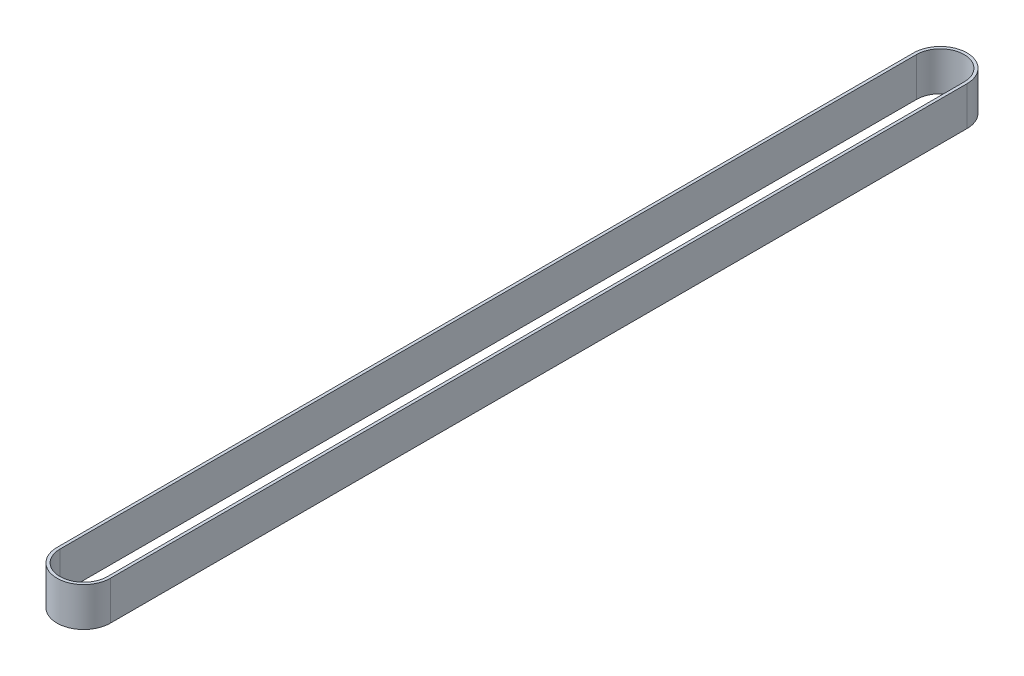
ISO-10303-21;
HEADER;
FILE_DESCRIPTION(('STEP AP214'),'2;1');
FILE_NAME('part.step','',(''),(''),'','','');
FILE_SCHEMA(('AUTOMOTIVE_DESIGN { 1 0 10303 214 1 1 1 1 }'));
ENDSEC;
DATA;
#1=APPLICATION_CONTEXT('core data for automotive mechanical design processes');
#2=APPLICATION_PROTOCOL_DEFINITION('international standard','automotive_design',2000,#1);
#3=PRODUCT_CONTEXT('',#1,'mechanical');
#4=PRODUCT('Part','Part','',(#3));
#5=PRODUCT_RELATED_PRODUCT_CATEGORY('part','',(#4));
#6=PRODUCT_DEFINITION_FORMATION('','',#4);
#7=PRODUCT_DEFINITION_CONTEXT('part definition',#1,'design');
#8=PRODUCT_DEFINITION('design','',#6,#7);
#9=PRODUCT_DEFINITION_SHAPE('','',#8);
#10=(LENGTH_UNIT() NAMED_UNIT(*) SI_UNIT(.MILLI.,.METRE.));
#11=(NAMED_UNIT(*) PLANE_ANGLE_UNIT() SI_UNIT($,.RADIAN.));
#12=(NAMED_UNIT(*) SI_UNIT($,.STERADIAN.) SOLID_ANGLE_UNIT());
#13=UNCERTAINTY_MEASURE_WITH_UNIT(LENGTH_MEASURE(1.E-05),#10,'distance_accuracy_value','');
#14=(GEOMETRIC_REPRESENTATION_CONTEXT(3) GLOBAL_UNCERTAINTY_ASSIGNED_CONTEXT((#13)) GLOBAL_UNIT_ASSIGNED_CONTEXT((#10,
#11,#12)) REPRESENTATION_CONTEXT('',''));
#15=CARTESIAN_POINT('',(0.,0.,0.));
#16=DIRECTION('',(0.,0.,1.));
#17=DIRECTION('',(1.,0.,0.));
#18=AXIS2_PLACEMENT_3D('',#15,#16,#17);
#19=CARTESIAN_POINT('',(0.,10.,110.05));
#20=DIRECTION('',(0.,1.,0.));
#21=DIRECTION('',(0.,0.,1.));
#22=AXIS2_PLACEMENT_3D('',#19,#20,#21);
#23=PLANE('',#22);
#24=CARTESIAN_POINT('',(0.,10.,110.05));
#25=DIRECTION('',(0.,1.,0.));
#26=DIRECTION('',(0.,0.,1.));
#27=AXIS2_PLACEMENT_3D('',#24,#25,#26);
#28=CIRCLE('',#27,6.86000000000003);
#29=CARTESIAN_POINT('',(-6.86000000000003,10.,110.05));
#30=VERTEX_POINT('',#29);
#31=CARTESIAN_POINT('',(6.86000000000003,10.,110.05));
#32=VERTEX_POINT('',#31);
#33=EDGE_CURVE('E142',#30,#32,#28,.T.);
#34=ORIENTED_EDGE('',*,*,#33,.T.);
#35=DIRECTION('',(0.,0.,-1.));
#36=VECTOR('',#35,1.);
#37=CARTESIAN_POINT('',(6.86000000000003,10.,110.05));
#38=LINE('',#37,#36);
#39=CARTESIAN_POINT('',(6.86,10.,-110.05));
#40=VERTEX_POINT('',#39);
#41=EDGE_CURVE('E145',#32,#40,#38,.T.);
#42=ORIENTED_EDGE('',*,*,#41,.T.);
#43=CARTESIAN_POINT('',(0.,10.,-110.05));
#44=DIRECTION('',(0.,1.,0.));
#45=DIRECTION('',(0.,0.,1.));
#46=AXIS2_PLACEMENT_3D('',#43,#44,#45);
#47=CIRCLE('',#46,6.86000000000003);
#48=CARTESIAN_POINT('',(-6.86000000000005,10.,-110.05));
#49=VERTEX_POINT('',#48);
#50=EDGE_CURVE('E148',#40,#49,#47,.T.);
#51=ORIENTED_EDGE('',*,*,#50,.T.);
#52=DIRECTION('',(0.,0.,1.));
#53=VECTOR('',#52,1.);
#54=CARTESIAN_POINT('',(-6.86000000000003,10.,110.05));
#55=LINE('',#54,#53);
#56=EDGE_CURVE('E150',#49,#30,#55,.T.);
#57=ORIENTED_EDGE('',*,*,#56,.T.);
#58=EDGE_LOOP('',(#34,#42,#51,#57));
#59=FACE_BOUND('',#58,.T.);
#60=DIRECTION('',(0.,0.,-1.));
#61=VECTOR('',#60,1.);
#62=CARTESIAN_POINT('',(6.11000000000006,10.,110.05));
#63=LINE('',#62,#61);
#64=CARTESIAN_POINT('',(6.11000000000006,10.,110.05));
#65=VERTEX_POINT('',#64);
#66=CARTESIAN_POINT('',(6.11000000000001,10.,-110.05));
#67=VERTEX_POINT('',#66);
#68=EDGE_CURVE('E114',#65,#67,#63,.T.);
#69=ORIENTED_EDGE('',*,*,#68,.F.);
#70=CARTESIAN_POINT('',(0.,10.,110.05));
#71=DIRECTION('',(0.,1.,0.));
#72=DIRECTION('',(0.,0.,1.));
#73=AXIS2_PLACEMENT_3D('',#70,#71,#72);
#74=CIRCLE('',#73,6.11);
#75=CARTESIAN_POINT('',(-6.10999999999994,10.,110.05));
#76=VERTEX_POINT('',#75);
#77=EDGE_CURVE('E106',#76,#65,#74,.T.);
#78=ORIENTED_EDGE('',*,*,#77,.F.);
#79=DIRECTION('',(0.,0.,1.));
#80=VECTOR('',#79,1.);
#81=CARTESIAN_POINT('',(-6.10999999999994,10.,110.05));
#82=LINE('',#81,#80);
#83=CARTESIAN_POINT('',(-6.10999999999999,10.,-110.05));
#84=VERTEX_POINT('',#83);
#85=EDGE_CURVE('E128',#84,#76,#82,.T.);
#86=ORIENTED_EDGE('',*,*,#85,.F.);
#87=CARTESIAN_POINT('',(0.,10.,-110.05));
#88=DIRECTION('',(0.,1.,0.));
#89=DIRECTION('',(0.,0.,1.));
#90=AXIS2_PLACEMENT_3D('',#87,#88,#89);
#91=CIRCLE('',#90,6.11);
#92=EDGE_CURVE('E126',#67,#84,#91,.T.);
#93=ORIENTED_EDGE('',*,*,#92,.F.);
#94=EDGE_LOOP('',(#69,#78,#86,#93));
#95=FACE_BOUND('',#94,.T.);
#96=ADVANCED_FACE('F41',(#59,#95),#23,.T.);
#97=CARTESIAN_POINT('',(0.,0.,110.05));
#98=DIRECTION('',(0.,1.,0.));
#99=DIRECTION('',(0.,0.,1.));
#100=AXIS2_PLACEMENT_3D('',#97,#98,#99);
#101=PLANE('',#100);
#102=CARTESIAN_POINT('',(0.,0.,110.05));
#103=DIRECTION('',(0.,1.,0.));
#104=DIRECTION('',(0.,0.,1.));
#105=AXIS2_PLACEMENT_3D('',#102,#103,#104);
#106=CIRCLE('',#105,6.86000000000003);
#107=CARTESIAN_POINT('',(-6.86000000000003,0.,110.05));
#108=VERTEX_POINT('',#107);
#109=CARTESIAN_POINT('',(6.86000000000003,0.,110.05));
#110=VERTEX_POINT('',#109);
#111=EDGE_CURVE('E122',#108,#110,#106,.T.);
#112=ORIENTED_EDGE('',*,*,#111,.F.);
#113=DIRECTION('',(0.,0.,1.));
#114=VECTOR('',#113,1.);
#115=CARTESIAN_POINT('',(-6.86000000000003,0.,110.05));
#116=LINE('',#115,#114);
#117=CARTESIAN_POINT('',(-6.86000000000005,0.,-110.05));
#118=VERTEX_POINT('',#117);
#119=EDGE_CURVE('E146',#118,#108,#116,.T.);
#120=ORIENTED_EDGE('',*,*,#119,.F.);
#121=CARTESIAN_POINT('',(0.,0.,-110.05));
#122=DIRECTION('',(0.,1.,0.));
#123=DIRECTION('',(0.,0.,1.));
#124=AXIS2_PLACEMENT_3D('',#121,#122,#123);
#125=CIRCLE('',#124,6.86000000000003);
#126=CARTESIAN_POINT('',(6.86,0.,-110.05));
#127=VERTEX_POINT('',#126);
#128=EDGE_CURVE('E157',#127,#118,#125,.T.);
#129=ORIENTED_EDGE('',*,*,#128,.F.);
#130=DIRECTION('',(0.,0.,-1.));
#131=VECTOR('',#130,1.);
#132=CARTESIAN_POINT('',(6.86000000000003,0.,110.05));
#133=LINE('',#132,#131);
#134=EDGE_CURVE('E155',#110,#127,#133,.T.);
#135=ORIENTED_EDGE('',*,*,#134,.F.);
#136=EDGE_LOOP('',(#112,#120,#129,#135));
#137=FACE_BOUND('',#136,.T.);
#138=CARTESIAN_POINT('',(0.,0.,110.05));
#139=DIRECTION('',(0.,1.,0.));
#140=DIRECTION('',(0.,0.,1.));
#141=AXIS2_PLACEMENT_3D('',#138,#139,#140);
#142=CIRCLE('',#141,6.11);
#143=CARTESIAN_POINT('',(-6.10999999999994,0.,110.05));
#144=VERTEX_POINT('',#143);
#145=CARTESIAN_POINT('',(6.11000000000006,0.,110.05));
#146=VERTEX_POINT('',#145);
#147=EDGE_CURVE('E64',#144,#146,#142,.T.);
#148=ORIENTED_EDGE('',*,*,#147,.T.);
#149=DIRECTION('',(0.,0.,-1.));
#150=VECTOR('',#149,1.);
#151=CARTESIAN_POINT('',(6.11000000000006,0.,110.05));
#152=LINE('',#151,#150);
#153=CARTESIAN_POINT('',(6.11000000000001,0.,-110.05));
#154=VERTEX_POINT('',#153);
#155=EDGE_CURVE('E121',#146,#154,#152,.T.);
#156=ORIENTED_EDGE('',*,*,#155,.T.);
#157=CARTESIAN_POINT('',(0.,0.,-110.05));
#158=DIRECTION('',(0.,1.,0.));
#159=DIRECTION('',(0.,0.,1.));
#160=AXIS2_PLACEMENT_3D('',#157,#158,#159);
#161=CIRCLE('',#160,6.11);
#162=CARTESIAN_POINT('',(-6.10999999999999,0.,-110.05));
#163=VERTEX_POINT('',#162);
#164=EDGE_CURVE('E134',#154,#163,#161,.T.);
#165=ORIENTED_EDGE('',*,*,#164,.T.);
#166=DIRECTION('',(0.,0.,1.));
#167=VECTOR('',#166,1.);
#168=CARTESIAN_POINT('',(-6.10999999999994,0.,110.05));
#169=LINE('',#168,#167);
#170=EDGE_CURVE('E115',#163,#144,#169,.T.);
#171=ORIENTED_EDGE('',*,*,#170,.T.);
#172=EDGE_LOOP('',(#148,#156,#165,#171));
#173=FACE_BOUND('',#172,.T.);
#174=ADVANCED_FACE('F175',(#137,#173),#101,.F.);
#175=CARTESIAN_POINT('',(0.,10.,110.05));
#176=DIRECTION('',(0.,-1.,0.));
#177=DIRECTION('',(0.,0.,-1.));
#178=AXIS2_PLACEMENT_3D('',#175,#176,#177);
#179=CYLINDRICAL_SURFACE('',#178,6.86000000000003);
#180=ORIENTED_EDGE('',*,*,#111,.T.);
#181=DIRECTION('',(0.,-1.,0.));
#182=VECTOR('',#181,1.);
#183=CARTESIAN_POINT('',(6.86000000000003,10.,110.05));
#184=LINE('',#183,#182);
#185=EDGE_CURVE('E11',#32,#110,#184,.T.);
#186=ORIENTED_EDGE('',*,*,#185,.F.);
#187=ORIENTED_EDGE('',*,*,#33,.F.);
#188=DIRECTION('',(0.,-1.,0.));
#189=VECTOR('',#188,1.);
#190=CARTESIAN_POINT('',(-6.86000000000003,10.,110.05));
#191=LINE('',#190,#189);
#192=EDGE_CURVE('E152',#30,#108,#191,.T.);
#193=ORIENTED_EDGE('',*,*,#192,.T.);
#194=EDGE_LOOP('',(#180,#186,#187,#193));
#195=FACE_BOUND('',#194,.T.);
#196=ADVANCED_FACE('F43',(#195),#179,.T.);
#197=CARTESIAN_POINT('',(6.86000000000003,10.,110.05));
#198=DIRECTION('',(-1.,0.,0.));
#199=DIRECTION('',(0.,0.,1.));
#200=AXIS2_PLACEMENT_3D('',#197,#198,#199);
#201=PLANE('',#200);
#202=ORIENTED_EDGE('',*,*,#134,.T.);
#203=DIRECTION('',(0.,-1.,0.));
#204=VECTOR('',#203,1.);
#205=CARTESIAN_POINT('',(6.86,10.,-110.05));
#206=LINE('',#205,#204);
#207=EDGE_CURVE('E49',#40,#127,#206,.T.);
#208=ORIENTED_EDGE('',*,*,#207,.F.);
#209=ORIENTED_EDGE('',*,*,#41,.F.);
#210=ORIENTED_EDGE('',*,*,#185,.T.);
#211=EDGE_LOOP('',(#202,#208,#209,#210));
#212=FACE_BOUND('',#211,.T.);
#213=ADVANCED_FACE('F185',(#212),#201,.F.);
#214=CARTESIAN_POINT('',(0.,10.,-110.05));
#215=DIRECTION('',(0.,-1.,0.));
#216=DIRECTION('',(0.,0.,-1.));
#217=AXIS2_PLACEMENT_3D('',#214,#215,#216);
#218=CYLINDRICAL_SURFACE('',#217,6.86000000000003);
#219=ORIENTED_EDGE('',*,*,#128,.T.);
#220=DIRECTION('',(0.,-1.,0.));
#221=VECTOR('',#220,1.);
#222=CARTESIAN_POINT('',(-6.86000000000005,10.,-110.05));
#223=LINE('',#222,#221);
#224=EDGE_CURVE('E162',#49,#118,#223,.T.);
#225=ORIENTED_EDGE('',*,*,#224,.F.);
#226=ORIENTED_EDGE('',*,*,#50,.F.);
#227=ORIENTED_EDGE('',*,*,#207,.T.);
#228=EDGE_LOOP('',(#219,#225,#226,#227));
#229=FACE_BOUND('',#228,.T.);
#230=ADVANCED_FACE('F169',(#229),#218,.T.);
#231=CARTESIAN_POINT('',(-6.86000000000003,10.,110.05));
#232=DIRECTION('',(1.,0.,0.));
#233=DIRECTION('',(0.,0.,-1.));
#234=AXIS2_PLACEMENT_3D('',#231,#232,#233);
#235=PLANE('',#234);
#236=ORIENTED_EDGE('',*,*,#119,.T.);
#237=ORIENTED_EDGE('',*,*,#192,.F.);
#238=ORIENTED_EDGE('',*,*,#56,.F.);
#239=ORIENTED_EDGE('',*,*,#224,.T.);
#240=EDGE_LOOP('',(#236,#237,#238,#239));
#241=FACE_BOUND('',#240,.T.);
#242=ADVANCED_FACE('F179',(#241),#235,.F.);
#243=CARTESIAN_POINT('',(0.,10.,110.05));
#244=DIRECTION('',(0.,-1.,0.));
#245=DIRECTION('',(0.,0.,-1.));
#246=AXIS2_PLACEMENT_3D('',#243,#244,#245);
#247=CYLINDRICAL_SURFACE('',#246,6.11);
#248=ORIENTED_EDGE('',*,*,#147,.F.);
#249=DIRECTION('',(0.,-1.,0.));
#250=VECTOR('',#249,1.);
#251=CARTESIAN_POINT('',(-6.10999999999994,10.,110.05));
#252=LINE('',#251,#250);
#253=EDGE_CURVE('E110',#76,#144,#252,.T.);
#254=ORIENTED_EDGE('',*,*,#253,.F.);
#255=ORIENTED_EDGE('',*,*,#77,.T.);
#256=DIRECTION('',(0.,-1.,0.));
#257=VECTOR('',#256,1.);
#258=CARTESIAN_POINT('',(6.11000000000006,10.,110.05));
#259=LINE('',#258,#257);
#260=EDGE_CURVE('E109',#65,#146,#259,.T.);
#261=ORIENTED_EDGE('',*,*,#260,.T.);
#262=EDGE_LOOP('',(#248,#254,#255,#261));
#263=FACE_BOUND('',#262,.T.);
#264=ADVANCED_FACE('F108',(#263),#247,.F.);
#265=CARTESIAN_POINT('',(6.11000000000006,10.,110.05));
#266=DIRECTION('',(-1.,0.,0.));
#267=DIRECTION('',(0.,0.,1.));
#268=AXIS2_PLACEMENT_3D('',#265,#266,#267);
#269=PLANE('',#268);
#270=ORIENTED_EDGE('',*,*,#155,.F.);
#271=ORIENTED_EDGE('',*,*,#260,.F.);
#272=ORIENTED_EDGE('',*,*,#68,.T.);
#273=DIRECTION('',(0.,-1.,0.));
#274=VECTOR('',#273,1.);
#275=CARTESIAN_POINT('',(6.11000000000001,10.,-110.05));
#276=LINE('',#275,#274);
#277=EDGE_CURVE('E123',#67,#154,#276,.T.);
#278=ORIENTED_EDGE('',*,*,#277,.T.);
#279=EDGE_LOOP('',(#270,#271,#272,#278));
#280=FACE_BOUND('',#279,.T.);
#281=ADVANCED_FACE('F118',(#280),#269,.T.);
#282=CARTESIAN_POINT('',(0.,10.,-110.05));
#283=DIRECTION('',(0.,-1.,0.));
#284=DIRECTION('',(0.,0.,-1.));
#285=AXIS2_PLACEMENT_3D('',#282,#283,#284);
#286=CYLINDRICAL_SURFACE('',#285,6.11);
#287=ORIENTED_EDGE('',*,*,#164,.F.);
#288=ORIENTED_EDGE('',*,*,#277,.F.);
#289=ORIENTED_EDGE('',*,*,#92,.T.);
#290=DIRECTION('',(0.,-1.,0.));
#291=VECTOR('',#290,1.);
#292=CARTESIAN_POINT('',(-6.10999999999999,10.,-110.05));
#293=LINE('',#292,#291);
#294=EDGE_CURVE('E56',#84,#163,#293,.T.);
#295=ORIENTED_EDGE('',*,*,#294,.T.);
#296=EDGE_LOOP('',(#287,#288,#289,#295));
#297=FACE_BOUND('',#296,.T.);
#298=ADVANCED_FACE('F208',(#297),#286,.F.);
#299=CARTESIAN_POINT('',(-6.10999999999994,10.,110.05));
#300=DIRECTION('',(1.,0.,0.));
#301=DIRECTION('',(0.,0.,-1.));
#302=AXIS2_PLACEMENT_3D('',#299,#300,#301);
#303=PLANE('',#302);
#304=ORIENTED_EDGE('',*,*,#170,.F.);
#305=ORIENTED_EDGE('',*,*,#294,.F.);
#306=ORIENTED_EDGE('',*,*,#85,.T.);
#307=ORIENTED_EDGE('',*,*,#253,.T.);
#308=EDGE_LOOP('',(#304,#305,#306,#307));
#309=FACE_BOUND('',#308,.T.);
#310=ADVANCED_FACE('F212',(#309),#303,.T.);
#311=CLOSED_SHELL('',(#96,#174,#196,#213,#230,#242,#264,#281,#298,#310));
#312=MANIFOLD_SOLID_BREP('B2',#311);
#313=ADVANCED_BREP_SHAPE_REPRESENTATION('',(#18,#312),#14);
#314=SHAPE_DEFINITION_REPRESENTATION(#9,#313);
ENDSEC;
END-ISO-10303-21;
